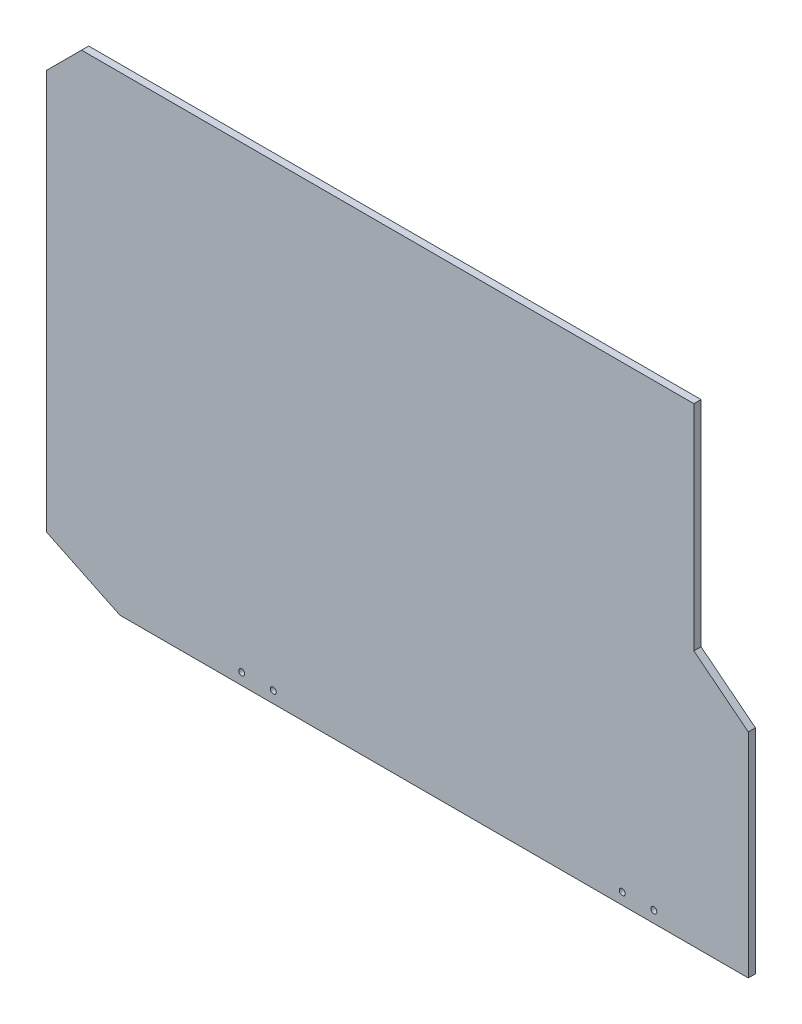
ISO-10303-21;
HEADER;
FILE_DESCRIPTION(('STEP AP214'),'2;1');
FILE_NAME('part.step','',(''),(''),'','','');
FILE_SCHEMA(('AUTOMOTIVE_DESIGN { 1 0 10303 214 1 1 1 1 }'));
ENDSEC;
DATA;
#1=APPLICATION_CONTEXT('core data for automotive mechanical design processes');
#2=APPLICATION_PROTOCOL_DEFINITION('international standard','automotive_design',2000,#1);
#3=PRODUCT_CONTEXT('',#1,'mechanical');
#4=PRODUCT('Part','Part','',(#3));
#5=PRODUCT_RELATED_PRODUCT_CATEGORY('part','',(#4));
#6=PRODUCT_DEFINITION_FORMATION('','',#4);
#7=PRODUCT_DEFINITION_CONTEXT('part definition',#1,'design');
#8=PRODUCT_DEFINITION('design','',#6,#7);
#9=PRODUCT_DEFINITION_SHAPE('','',#8);
#10=(LENGTH_UNIT() NAMED_UNIT(*) SI_UNIT(.MILLI.,.METRE.));
#11=(NAMED_UNIT(*) PLANE_ANGLE_UNIT() SI_UNIT($,.RADIAN.));
#12=(NAMED_UNIT(*) SI_UNIT($,.STERADIAN.) SOLID_ANGLE_UNIT());
#13=UNCERTAINTY_MEASURE_WITH_UNIT(LENGTH_MEASURE(1.E-05),#10,'distance_accuracy_value','');
#14=(GEOMETRIC_REPRESENTATION_CONTEXT(3) GLOBAL_UNCERTAINTY_ASSIGNED_CONTEXT((#13)) GLOBAL_UNIT_ASSIGNED_CONTEXT((#10,
#11,#12)) REPRESENTATION_CONTEXT('',''));
#15=CARTESIAN_POINT('',(0.,0.,0.));
#16=DIRECTION('',(0.,0.,1.));
#17=DIRECTION('',(1.,0.,0.));
#18=AXIS2_PLACEMENT_3D('',#15,#16,#17);
#19=CARTESIAN_POINT('',(-29.4999999999976,326.885786437627,-5.));
#20=DIRECTION('',(-0.707106781186548,0.707106781186547,0.));
#21=DIRECTION('',(-0.707106781186547,-0.707106781186548,0.));
#22=AXIS2_PLACEMENT_3D('',#19,#20,#21);
#23=PLANE('',#22);
#24=DIRECTION('',(-0.707106781186547,-0.707106781186548,0.));
#25=VECTOR('',#24,1.);
#26=CARTESIAN_POINT('',(-29.4999999999976,326.885786437627,0.));
#27=LINE('',#26,#25);
#28=CARTESIAN_POINT('',(-5.08578643762379,351.300000000001,0.));
#29=VERTEX_POINT('',#28);
#30=CARTESIAN_POINT('',(-29.4999999999976,326.885786437627,0.));
#31=VERTEX_POINT('',#30);
#32=EDGE_CURVE('E141',#29,#31,#27,.T.);
#33=ORIENTED_EDGE('',*,*,#32,.F.);
#34=DIRECTION('',(0.,0.,1.));
#35=VECTOR('',#34,1.);
#36=CARTESIAN_POINT('',(-5.08578643762379,351.300000000001,-5.));
#37=LINE('',#36,#35);
#38=CARTESIAN_POINT('',(-5.08578643762379,351.300000000001,-5.));
#39=VERTEX_POINT('',#38);
#40=EDGE_CURVE('E11',#39,#29,#37,.T.);
#41=ORIENTED_EDGE('',*,*,#40,.F.);
#42=DIRECTION('',(-0.707106781186547,-0.707106781186548,0.));
#43=VECTOR('',#42,1.);
#44=CARTESIAN_POINT('',(-29.4999999999976,326.885786437627,-5.));
#45=LINE('',#44,#43);
#46=CARTESIAN_POINT('',(-29.4999999999976,326.885786437627,-5.));
#47=VERTEX_POINT('',#46);
#48=EDGE_CURVE('E170',#39,#47,#45,.T.);
#49=ORIENTED_EDGE('',*,*,#48,.T.);
#50=DIRECTION('',(0.,0.,1.));
#51=VECTOR('',#50,1.);
#52=CARTESIAN_POINT('',(-29.4999999999976,326.885786437627,-5.));
#53=LINE('',#52,#51);
#54=EDGE_CURVE('E39',#47,#31,#53,.T.);
#55=ORIENTED_EDGE('',*,*,#54,.T.);
#56=EDGE_LOOP('',(#33,#41,#49,#55));
#57=FACE_BOUND('',#56,.T.);
#58=ADVANCED_FACE('F36',(#57),#23,.T.);
#59=CARTESIAN_POINT('',(422.500000000001,351.300000000001,-5.));
#60=DIRECTION('',(0.,1.,0.));
#61=DIRECTION('',(0.,0.,1.));
#62=AXIS2_PLACEMENT_3D('',#59,#60,#61);
#63=PLANE('',#62);
#64=DIRECTION('',(-1.,0.,0.));
#65=VECTOR('',#64,1.);
#66=CARTESIAN_POINT('',(422.500000000001,351.300000000001,0.));
#67=LINE('',#66,#65);
#68=CARTESIAN_POINT('',(422.500000000001,351.300000000001,0.));
#69=VERTEX_POINT('',#68);
#70=EDGE_CURVE('E167',#69,#29,#67,.T.);
#71=ORIENTED_EDGE('',*,*,#70,.F.);
#72=DIRECTION('',(0.,0.,1.));
#73=VECTOR('',#72,1.);
#74=CARTESIAN_POINT('',(422.500000000001,351.300000000001,-5.));
#75=LINE('',#74,#73);
#76=CARTESIAN_POINT('',(422.500000000001,351.300000000001,-5.));
#77=VERTEX_POINT('',#76);
#78=EDGE_CURVE('E46',#77,#69,#75,.T.);
#79=ORIENTED_EDGE('',*,*,#78,.F.);
#80=DIRECTION('',(-1.,0.,0.));
#81=VECTOR('',#80,1.);
#82=CARTESIAN_POINT('',(422.500000000001,351.300000000001,-5.));
#83=LINE('',#82,#81);
#84=EDGE_CURVE('E125',#77,#39,#83,.T.);
#85=ORIENTED_EDGE('',*,*,#84,.T.);
#86=ORIENTED_EDGE('',*,*,#40,.T.);
#87=EDGE_LOOP('',(#71,#79,#85,#86));
#88=FACE_BOUND('',#87,.T.);
#89=ADVANCED_FACE('F189',(#88),#63,.T.);
#90=CARTESIAN_POINT('',(422.500000000001,351.300000000001,-5.));
#91=DIRECTION('',(1.,0.,0.));
#92=DIRECTION('',(0.,0.,-1.));
#93=AXIS2_PLACEMENT_3D('',#90,#91,#92);
#94=PLANE('',#93);
#95=DIRECTION('',(0.,1.,0.));
#96=VECTOR('',#95,1.);
#97=CARTESIAN_POINT('',(422.500000000001,351.300000000001,0.));
#98=LINE('',#97,#96);
#99=CARTESIAN_POINT('',(422.500000000001,201.815398059273,0.));
#100=VERTEX_POINT('',#99);
#101=EDGE_CURVE('E111',#100,#69,#98,.T.);
#102=ORIENTED_EDGE('',*,*,#101,.F.);
#103=DIRECTION('',(0.,0.,1.));
#104=VECTOR('',#103,1.);
#105=CARTESIAN_POINT('',(422.500000000001,201.815398059273,-5.));
#106=LINE('',#105,#104);
#107=CARTESIAN_POINT('',(422.500000000001,201.815398059273,-5.));
#108=VERTEX_POINT('',#107);
#109=EDGE_CURVE('E106',#108,#100,#106,.T.);
#110=ORIENTED_EDGE('',*,*,#109,.F.);
#111=DIRECTION('',(0.,1.,0.));
#112=VECTOR('',#111,1.);
#113=CARTESIAN_POINT('',(422.500000000001,351.300000000001,-5.));
#114=LINE('',#113,#112);
#115=EDGE_CURVE('E109',#108,#77,#114,.T.);
#116=ORIENTED_EDGE('',*,*,#115,.T.);
#117=ORIENTED_EDGE('',*,*,#78,.T.);
#118=EDGE_LOOP('',(#102,#110,#116,#117));
#119=FACE_BOUND('',#118,.T.);
#120=ADVANCED_FACE('F108',(#119),#94,.T.);
#121=CARTESIAN_POINT('',(422.500000000001,201.815398059273,-5.));
#122=DIRECTION('',(0.619644288579022,0.784882765533426,0.));
#123=DIRECTION('',(-0.784882765533426,0.619644288579022,0.));
#124=AXIS2_PLACEMENT_3D('',#121,#122,#123);
#125=PLANE('',#124);
#126=DIRECTION('',(-0.784882765533426,0.619644288579022,0.));
#127=VECTOR('',#126,1.);
#128=CARTESIAN_POINT('',(422.500000000001,201.815398059273,0.));
#129=LINE('',#128,#127);
#130=CARTESIAN_POINT('',(460.500000000001,171.815398059273,0.));
#131=VERTEX_POINT('',#130);
#132=EDGE_CURVE('E162',#131,#100,#129,.T.);
#133=ORIENTED_EDGE('',*,*,#132,.F.);
#134=DIRECTION('',(0.,0.,1.));
#135=VECTOR('',#134,1.);
#136=CARTESIAN_POINT('',(460.500000000001,171.815398059273,-5.));
#137=LINE('',#136,#135);
#138=CARTESIAN_POINT('',(460.500000000001,171.815398059273,-5.));
#139=VERTEX_POINT('',#138);
#140=EDGE_CURVE('E117',#139,#131,#137,.T.);
#141=ORIENTED_EDGE('',*,*,#140,.F.);
#142=DIRECTION('',(-0.784882765533426,0.619644288579022,0.));
#143=VECTOR('',#142,1.);
#144=CARTESIAN_POINT('',(422.500000000001,201.815398059273,-5.));
#145=LINE('',#144,#143);
#146=EDGE_CURVE('E123',#139,#108,#145,.T.);
#147=ORIENTED_EDGE('',*,*,#146,.T.);
#148=ORIENTED_EDGE('',*,*,#109,.T.);
#149=EDGE_LOOP('',(#133,#141,#147,#148));
#150=FACE_BOUND('',#149,.T.);
#151=ADVANCED_FACE('F128',(#150),#125,.T.);
#152=CARTESIAN_POINT('',(460.500000000001,23.0000000000002,-5.));
#153=DIRECTION('',(1.,0.,0.));
#154=DIRECTION('',(0.,0.,-1.));
#155=AXIS2_PLACEMENT_3D('',#152,#153,#154);
#156=PLANE('',#155);
#157=DIRECTION('',(0.,1.,0.));
#158=VECTOR('',#157,1.);
#159=CARTESIAN_POINT('',(460.500000000001,23.0000000000002,0.));
#160=LINE('',#159,#158);
#161=CARTESIAN_POINT('',(460.500000000001,23.0000000000002,0.));
#162=VERTEX_POINT('',#161);
#163=EDGE_CURVE('E158',#162,#131,#160,.T.);
#164=ORIENTED_EDGE('',*,*,#163,.F.);
#165=DIRECTION('',(0.,0.,1.));
#166=VECTOR('',#165,1.);
#167=CARTESIAN_POINT('',(460.500000000001,23.0000000000002,-5.));
#168=LINE('',#167,#166);
#169=CARTESIAN_POINT('',(460.500000000001,23.0000000000002,-5.));
#170=VERTEX_POINT('',#169);
#171=EDGE_CURVE('E176',#170,#162,#168,.T.);
#172=ORIENTED_EDGE('',*,*,#171,.F.);
#173=DIRECTION('',(0.,1.,0.));
#174=VECTOR('',#173,1.);
#175=CARTESIAN_POINT('',(460.500000000001,23.0000000000002,-5.));
#176=LINE('',#175,#174);
#177=EDGE_CURVE('E130',#170,#139,#176,.T.);
#178=ORIENTED_EDGE('',*,*,#177,.T.);
#179=ORIENTED_EDGE('',*,*,#140,.T.);
#180=EDGE_LOOP('',(#164,#172,#178,#179));
#181=FACE_BOUND('',#180,.T.);
#182=ADVANCED_FACE('F202',(#181),#156,.T.);
#183=CARTESIAN_POINT('',(21.7278994778829,23.0000000000002,-5.));
#184=DIRECTION('',(0.,-1.,0.));
#185=DIRECTION('',(0.,0.,-1.));
#186=AXIS2_PLACEMENT_3D('',#183,#184,#185);
#187=PLANE('',#186);
#188=DIRECTION('',(1.,0.,0.));
#189=VECTOR('',#188,1.);
#190=CARTESIAN_POINT('',(21.7278994778829,23.0000000000002,0.));
#191=LINE('',#190,#189);
#192=CARTESIAN_POINT('',(21.7278994778829,23.0000000000002,0.));
#193=VERTEX_POINT('',#192);
#194=EDGE_CURVE('E154',#193,#162,#191,.T.);
#195=ORIENTED_EDGE('',*,*,#194,.F.);
#196=DIRECTION('',(0.,0.,1.));
#197=VECTOR('',#196,1.);
#198=CARTESIAN_POINT('',(21.7278994778829,23.0000000000002,-5.));
#199=LINE('',#198,#197);
#200=CARTESIAN_POINT('',(21.7278994778829,23.0000000000002,-5.));
#201=VERTEX_POINT('',#200);
#202=EDGE_CURVE('E179',#201,#193,#199,.T.);
#203=ORIENTED_EDGE('',*,*,#202,.F.);
#204=DIRECTION('',(1.,0.,0.));
#205=VECTOR('',#204,1.);
#206=CARTESIAN_POINT('',(21.7278994778829,23.0000000000002,-5.));
#207=LINE('',#206,#205);
#208=EDGE_CURVE('E135',#201,#170,#207,.T.);
#209=ORIENTED_EDGE('',*,*,#208,.T.);
#210=ORIENTED_EDGE('',*,*,#171,.T.);
#211=EDGE_LOOP('',(#195,#203,#209,#210));
#212=FACE_BOUND('',#211,.T.);
#213=ADVANCED_FACE('F205',(#212),#187,.T.);
#214=CARTESIAN_POINT('',(21.7278994778829,23.0000000000002,-5.));
#215=DIRECTION('',(-0.433294434867878,-0.901252424525186,0.));
#216=DIRECTION('',(0.901252424525186,-0.433294434867878,0.));
#217=AXIS2_PLACEMENT_3D('',#214,#215,#216);
#218=PLANE('',#217);
#219=DIRECTION('',(0.901252424525186,-0.433294434867878,0.));
#220=VECTOR('',#219,1.);
#221=CARTESIAN_POINT('',(21.7278994778829,23.0000000000002,0.));
#222=LINE('',#221,#220);
#223=CARTESIAN_POINT('',(-29.4999999999976,47.6287978259043,0.));
#224=VERTEX_POINT('',#223);
#225=EDGE_CURVE('E150',#224,#193,#222,.T.);
#226=ORIENTED_EDGE('',*,*,#225,.F.);
#227=DIRECTION('',(0.,0.,1.));
#228=VECTOR('',#227,1.);
#229=CARTESIAN_POINT('',(-29.4999999999976,47.6287978259043,-5.));
#230=LINE('',#229,#228);
#231=CARTESIAN_POINT('',(-29.4999999999976,47.6287978259043,-5.));
#232=VERTEX_POINT('',#231);
#233=EDGE_CURVE('E181',#232,#224,#230,.T.);
#234=ORIENTED_EDGE('',*,*,#233,.F.);
#235=DIRECTION('',(0.901252424525186,-0.433294434867878,0.));
#236=VECTOR('',#235,1.);
#237=CARTESIAN_POINT('',(21.7278994778829,23.0000000000002,-5.));
#238=LINE('',#237,#236);
#239=EDGE_CURVE('E280',#232,#201,#238,.T.);
#240=ORIENTED_EDGE('',*,*,#239,.T.);
#241=ORIENTED_EDGE('',*,*,#202,.T.);
#242=EDGE_LOOP('',(#226,#234,#240,#241));
#243=FACE_BOUND('',#242,.T.);
#244=ADVANCED_FACE('F209',(#243),#218,.T.);
#245=CARTESIAN_POINT('',(-29.4999999999976,326.885786437627,-5.));
#246=DIRECTION('',(-1.,0.,0.));
#247=DIRECTION('',(0.,-1.,0.));
#248=AXIS2_PLACEMENT_3D('',#245,#246,#247);
#249=PLANE('',#248);
#250=DIRECTION('',(0.,-1.,0.));
#251=VECTOR('',#250,1.);
#252=CARTESIAN_POINT('',(-29.4999999999976,326.885786437627,0.));
#253=LINE('',#252,#251);
#254=EDGE_CURVE('E145',#31,#224,#253,.T.);
#255=ORIENTED_EDGE('',*,*,#254,.F.);
#256=ORIENTED_EDGE('',*,*,#54,.F.);
#257=DIRECTION('',(0.,-1.,0.));
#258=VECTOR('',#257,1.);
#259=CARTESIAN_POINT('',(-29.4999999999976,326.885786437627,-5.));
#260=LINE('',#259,#258);
#261=EDGE_CURVE('E277',#47,#232,#260,.T.);
#262=ORIENTED_EDGE('',*,*,#261,.T.);
#263=ORIENTED_EDGE('',*,*,#233,.T.);
#264=EDGE_LOOP('',(#255,#256,#262,#263));
#265=FACE_BOUND('',#264,.T.);
#266=ADVANCED_FACE('F186',(#265),#249,.T.);
#267=CARTESIAN_POINT('',(0.,0.,-5.));
#268=DIRECTION('',(0.,0.,-1.));
#269=DIRECTION('',(-1.,0.,0.));
#270=AXIS2_PLACEMENT_3D('',#267,#268,#269);
#271=PLANE('',#270);
#272=CARTESIAN_POINT('',(106.800000000002,31.0000000000002,-5.));
#273=DIRECTION('',(0.,0.,1.));
#274=DIRECTION('',(1.,0.,0.));
#275=AXIS2_PLACEMENT_3D('',#272,#273,#274);
#276=CIRCLE('',#275,2.09999999999999);
#277=CARTESIAN_POINT('',(108.900000000002,31.0000000000002,-5.));
#278=VERTEX_POINT('',#277);
#279=EDGE_CURVE('E146',#278,#278,#276,.T.);
#280=ORIENTED_EDGE('',*,*,#279,.T.);
#281=EDGE_LOOP('',(#280));
#282=FACE_BOUND('',#281,.T.);
#283=CARTESIAN_POINT('',(128.800000000002,31.0000000000002,-5.));
#284=DIRECTION('',(0.,0.,1.));
#285=DIRECTION('',(1.,0.,0.));
#286=AXIS2_PLACEMENT_3D('',#283,#284,#285);
#287=CIRCLE('',#286,2.09999999999999);
#288=CARTESIAN_POINT('',(130.900000000002,31.0000000000002,-5.));
#289=VERTEX_POINT('',#288);
#290=EDGE_CURVE('E247',#289,#289,#287,.T.);
#291=ORIENTED_EDGE('',*,*,#290,.T.);
#292=EDGE_LOOP('',(#291));
#293=FACE_BOUND('',#292,.T.);
#294=CARTESIAN_POINT('',(372.500000000001,31.0000000000002,-5.));
#295=DIRECTION('',(0.,0.,1.));
#296=DIRECTION('',(1.,0.,0.));
#297=AXIS2_PLACEMENT_3D('',#294,#295,#296);
#298=CIRCLE('',#297,2.09999999999999);
#299=CARTESIAN_POINT('',(374.600000000001,31.0000000000002,-5.));
#300=VERTEX_POINT('',#299);
#301=EDGE_CURVE('E259',#300,#300,#298,.T.);
#302=ORIENTED_EDGE('',*,*,#301,.T.);
#303=EDGE_LOOP('',(#302));
#304=FACE_BOUND('',#303,.T.);
#305=CARTESIAN_POINT('',(394.500000000001,31.0000000000002,-5.));
#306=DIRECTION('',(0.,0.,1.));
#307=DIRECTION('',(1.,0.,0.));
#308=AXIS2_PLACEMENT_3D('',#305,#306,#307);
#309=CIRCLE('',#308,2.09999999999999);
#310=CARTESIAN_POINT('',(396.600000000001,31.0000000000002,-5.));
#311=VERTEX_POINT('',#310);
#312=EDGE_CURVE('E267',#311,#311,#309,.T.);
#313=ORIENTED_EDGE('',*,*,#312,.T.);
#314=EDGE_LOOP('',(#313));
#315=FACE_BOUND('',#314,.T.);
#316=ORIENTED_EDGE('',*,*,#48,.F.);
#317=ORIENTED_EDGE('',*,*,#84,.F.);
#318=ORIENTED_EDGE('',*,*,#115,.F.);
#319=ORIENTED_EDGE('',*,*,#146,.F.);
#320=ORIENTED_EDGE('',*,*,#177,.F.);
#321=ORIENTED_EDGE('',*,*,#208,.F.);
#322=ORIENTED_EDGE('',*,*,#239,.F.);
#323=ORIENTED_EDGE('',*,*,#261,.F.);
#324=EDGE_LOOP('',(#316,#317,#318,#319,#320,#321,#322,#323));
#325=FACE_BOUND('',#324,.T.);
#326=ADVANCED_FACE('F121',(#282,#293,#304,#315,#325),#271,.T.);
#327=CARTESIAN_POINT('',(0.,0.,0.));
#328=DIRECTION('',(0.,0.,-1.));
#329=DIRECTION('',(-1.,0.,0.));
#330=AXIS2_PLACEMENT_3D('',#327,#328,#329);
#331=PLANE('',#330);
#332=CARTESIAN_POINT('',(106.800000000002,31.0000000000002,0.));
#333=DIRECTION('',(0.,0.,1.));
#334=DIRECTION('',(1.,0.,0.));
#335=AXIS2_PLACEMENT_3D('',#332,#333,#334);
#336=CIRCLE('',#335,2.09999999999999);
#337=CARTESIAN_POINT('',(108.900000000002,31.0000000000002,0.));
#338=VERTEX_POINT('',#337);
#339=EDGE_CURVE('E246',#338,#338,#336,.T.);
#340=ORIENTED_EDGE('',*,*,#339,.F.);
#341=EDGE_LOOP('',(#340));
#342=FACE_BOUND('',#341,.T.);
#343=CARTESIAN_POINT('',(128.800000000002,31.0000000000002,0.));
#344=DIRECTION('',(0.,0.,1.));
#345=DIRECTION('',(1.,0.,0.));
#346=AXIS2_PLACEMENT_3D('',#343,#344,#345);
#347=CIRCLE('',#346,2.09999999999999);
#348=CARTESIAN_POINT('',(130.900000000002,31.0000000000002,0.));
#349=VERTEX_POINT('',#348);
#350=EDGE_CURVE('E253',#349,#349,#347,.T.);
#351=ORIENTED_EDGE('',*,*,#350,.F.);
#352=EDGE_LOOP('',(#351));
#353=FACE_BOUND('',#352,.T.);
#354=CARTESIAN_POINT('',(372.500000000001,31.0000000000002,0.));
#355=DIRECTION('',(0.,0.,1.));
#356=DIRECTION('',(1.,0.,0.));
#357=AXIS2_PLACEMENT_3D('',#354,#355,#356);
#358=CIRCLE('',#357,2.09999999999999);
#359=CARTESIAN_POINT('',(374.600000000001,31.0000000000002,0.));
#360=VERTEX_POINT('',#359);
#361=EDGE_CURVE('E263',#360,#360,#358,.T.);
#362=ORIENTED_EDGE('',*,*,#361,.F.);
#363=EDGE_LOOP('',(#362));
#364=FACE_BOUND('',#363,.T.);
#365=CARTESIAN_POINT('',(394.500000000001,31.0000000000002,0.));
#366=DIRECTION('',(0.,0.,1.));
#367=DIRECTION('',(1.,0.,0.));
#368=AXIS2_PLACEMENT_3D('',#365,#366,#367);
#369=CIRCLE('',#368,2.09999999999999);
#370=CARTESIAN_POINT('',(396.600000000001,31.0000000000002,0.));
#371=VERTEX_POINT('',#370);
#372=EDGE_CURVE('E271',#371,#371,#369,.T.);
#373=ORIENTED_EDGE('',*,*,#372,.F.);
#374=EDGE_LOOP('',(#373));
#375=FACE_BOUND('',#374,.T.);
#376=ORIENTED_EDGE('',*,*,#32,.T.);
#377=ORIENTED_EDGE('',*,*,#254,.T.);
#378=ORIENTED_EDGE('',*,*,#225,.T.);
#379=ORIENTED_EDGE('',*,*,#194,.T.);
#380=ORIENTED_EDGE('',*,*,#163,.T.);
#381=ORIENTED_EDGE('',*,*,#132,.T.);
#382=ORIENTED_EDGE('',*,*,#101,.T.);
#383=ORIENTED_EDGE('',*,*,#70,.T.);
#384=EDGE_LOOP('',(#376,#377,#378,#379,#380,#381,#382,#383));
#385=FACE_BOUND('',#384,.T.);
#386=ADVANCED_FACE('F188',(#342,#353,#364,#375,#385),#331,.F.);
#387=CARTESIAN_POINT('',(394.500000000001,31.0000000000002,-5.));
#388=DIRECTION('',(0.,0.,1.));
#389=DIRECTION('',(1.,0.,0.));
#390=AXIS2_PLACEMENT_3D('',#387,#388,#389);
#391=CYLINDRICAL_SURFACE('',#390,2.09999999999999);
#392=ORIENTED_EDGE('',*,*,#312,.F.);
#393=EDGE_LOOP('',(#392));
#394=FACE_BOUND('',#393,.T.);
#395=ORIENTED_EDGE('',*,*,#372,.T.);
#396=EDGE_LOOP('',(#395));
#397=FACE_BOUND('',#396,.T.);
#398=ADVANCED_FACE('F221',(#394,#397),#391,.F.);
#399=CARTESIAN_POINT('',(372.500000000001,31.0000000000002,-5.));
#400=DIRECTION('',(0.,0.,1.));
#401=DIRECTION('',(1.,0.,0.));
#402=AXIS2_PLACEMENT_3D('',#399,#400,#401);
#403=CYLINDRICAL_SURFACE('',#402,2.09999999999999);
#404=ORIENTED_EDGE('',*,*,#301,.F.);
#405=EDGE_LOOP('',(#404));
#406=FACE_BOUND('',#405,.T.);
#407=ORIENTED_EDGE('',*,*,#361,.T.);
#408=EDGE_LOOP('',(#407));
#409=FACE_BOUND('',#408,.T.);
#410=ADVANCED_FACE('F228',(#406,#409),#403,.F.);
#411=CARTESIAN_POINT('',(128.800000000002,31.0000000000002,-5.));
#412=DIRECTION('',(0.,0.,1.));
#413=DIRECTION('',(1.,0.,0.));
#414=AXIS2_PLACEMENT_3D('',#411,#412,#413);
#415=CYLINDRICAL_SURFACE('',#414,2.09999999999999);
#416=ORIENTED_EDGE('',*,*,#290,.F.);
#417=EDGE_LOOP('',(#416));
#418=FACE_BOUND('',#417,.T.);
#419=ORIENTED_EDGE('',*,*,#350,.T.);
#420=EDGE_LOOP('',(#419));
#421=FACE_BOUND('',#420,.T.);
#422=ADVANCED_FACE('F232',(#418,#421),#415,.F.);
#423=CARTESIAN_POINT('',(106.800000000002,31.0000000000002,-5.));
#424=DIRECTION('',(0.,0.,1.));
#425=DIRECTION('',(1.,0.,0.));
#426=AXIS2_PLACEMENT_3D('',#423,#424,#425);
#427=CYLINDRICAL_SURFACE('',#426,2.09999999999999);
#428=ORIENTED_EDGE('',*,*,#279,.F.);
#429=EDGE_LOOP('',(#428));
#430=FACE_BOUND('',#429,.T.);
#431=ORIENTED_EDGE('',*,*,#339,.T.);
#432=EDGE_LOOP('',(#431));
#433=FACE_BOUND('',#432,.T.);
#434=ADVANCED_FACE('F236',(#430,#433),#427,.F.);
#435=CLOSED_SHELL('',(#58,#89,#120,#151,#182,#213,#244,#266,#326,#386,#398,#410,#422,#434));
#436=MANIFOLD_SOLID_BREP('B2',#435);
#437=ADVANCED_BREP_SHAPE_REPRESENTATION('',(#18,#436),#14);
#438=SHAPE_DEFINITION_REPRESENTATION(#9,#437);
ENDSEC;
END-ISO-10303-21;
